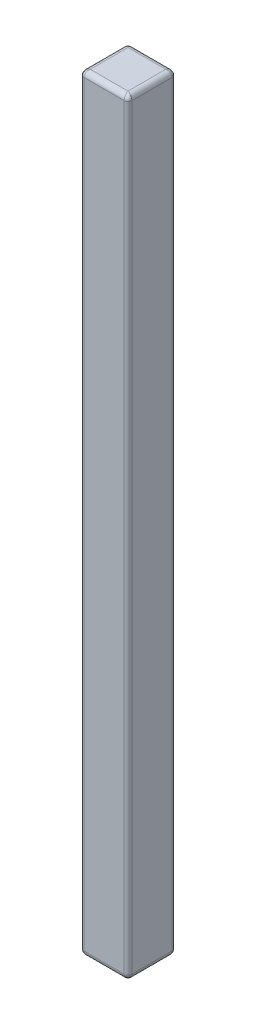
ISO-10303-21;
HEADER;
FILE_DESCRIPTION(('STEP AP214'),'2;1');
FILE_NAME('part.step','',(''),(''),'','','');
FILE_SCHEMA(('AUTOMOTIVE_DESIGN { 1 0 10303 214 1 1 1 1 }'));
ENDSEC;
DATA;
#1=APPLICATION_CONTEXT('core data for automotive mechanical design processes');
#2=APPLICATION_PROTOCOL_DEFINITION('international standard','automotive_design',2000,#1);
#3=PRODUCT_CONTEXT('',#1,'mechanical');
#4=PRODUCT('Part','Part','',(#3));
#5=PRODUCT_RELATED_PRODUCT_CATEGORY('part','',(#4));
#6=PRODUCT_DEFINITION_FORMATION('','',#4);
#7=PRODUCT_DEFINITION_CONTEXT('part definition',#1,'design');
#8=PRODUCT_DEFINITION('design','',#6,#7);
#9=PRODUCT_DEFINITION_SHAPE('','',#8);
#10=(LENGTH_UNIT() NAMED_UNIT(*) SI_UNIT(.MILLI.,.METRE.));
#11=(NAMED_UNIT(*) PLANE_ANGLE_UNIT() SI_UNIT($,.RADIAN.));
#12=(NAMED_UNIT(*) SI_UNIT($,.STERADIAN.) SOLID_ANGLE_UNIT());
#13=UNCERTAINTY_MEASURE_WITH_UNIT(LENGTH_MEASURE(1.E-05),#10,'distance_accuracy_value','');
#14=(GEOMETRIC_REPRESENTATION_CONTEXT(3) GLOBAL_UNCERTAINTY_ASSIGNED_CONTEXT((#13)) GLOBAL_UNIT_ASSIGNED_CONTEXT((#10,
#11,#12)) REPRESENTATION_CONTEXT('',''));
#15=CARTESIAN_POINT('',(0.,0.,0.));
#16=DIRECTION('',(0.,0.,1.));
#17=DIRECTION('',(1.,0.,0.));
#18=AXIS2_PLACEMENT_3D('',#15,#16,#17);
#19=CARTESIAN_POINT('',(1.475,0.,1.475));
#20=CARTESIAN_POINT('',(1.56475979010257,0.,1.49743994752564));
#21=CARTESIAN_POINT('',(1.77478910429061,0.0728311305779759,1.54994727607265));
#22=CARTESIAN_POINT('',(1.875,0.280320279863246,1.575));
#23=CARTESIAN_POINT('',(1.875,0.4,1.575));
#24=CARTESIAN_POINT('',(1.475,0.,1.475));
#25=CARTESIAN_POINT('',(1.55353981633974,0.,1.50865992128846));
#26=CARTESIAN_POINT('',(1.73652906928958,0.0438903059349456,1.58589297159778));
#27=CARTESIAN_POINT('',(1.875,0.256589087450941,1.65353981633975));
#28=CARTESIAN_POINT('',(1.875,0.4,1.65353981633975));
#29=CARTESIAN_POINT('',(1.475,0.,1.475));
#30=CARTESIAN_POINT('',(1.5310998688141,0.,1.5310998688141));
#31=CARTESIAN_POINT('',(1.65804151710079,0.0137242028562862,1.65804151710079));
#32=CARTESIAN_POINT('',(1.81013802673133,0.229651477541339,1.81013802673133));
#33=CARTESIAN_POINT('',(1.81013802673133,0.4,1.81013802673133));
#34=CARTESIAN_POINT('',(1.475,0.,1.475));
#35=CARTESIAN_POINT('',(1.50865992128846,0.,1.55353981633975));
#36=CARTESIAN_POINT('',(1.58589297159778,0.043890305934946,1.73652906928958));
#37=CARTESIAN_POINT('',(1.65353981633975,0.256589087450942,1.875));
#38=CARTESIAN_POINT('',(1.65353981633975,0.4,1.875));
#39=CARTESIAN_POINT('',(1.475,0.,1.475));
#40=CARTESIAN_POINT('',(1.49743994752564,0.,1.56475979010257));
#41=CARTESIAN_POINT('',(1.54994727607265,0.0728311305779767,1.77478910429061));
#42=CARTESIAN_POINT('',(1.575,0.280320279863246,1.875));
#43=CARTESIAN_POINT('',(1.575,0.4,1.875));
#44=B_SPLINE_SURFACE_WITH_KNOTS('',3,3,((#19,#20,#21,#22,#23),(#24,#25,#26,#27,#28),(#29,#30,
#31,#32,#33),(#34,#35,#36,#37,#38),(#39,#40,#41,#42,#43)),.UNSPECIFIED.,.F.,.F.,.F.,(4,1,4),(4,
1,4),(0.,0.5,1.),(-1.57079632679489,-0.897597901025654,0.),.UNSPECIFIED.);
#45=CARTESIAN_POINT('',(1.575,0.4,1.875));
#46=CARTESIAN_POINT('',(1.575,0.280320279863245,1.875));
#47=CARTESIAN_POINT('',(1.54994727607265,0.0728311305779759,1.77478910429061));
#48=CARTESIAN_POINT('',(1.49743994752564,0.,1.56475979010257));
#49=CARTESIAN_POINT('',(1.475,0.,1.475));
#50=B_SPLINE_CURVE_WITH_KNOTS('',3,(#45,#46,#47,#48,#49),.UNSPECIFIED.,.F.,.F.,(4,1,4),
(-1.57079632679489,-0.673198425769236,0.),.UNSPECIFIED.);
#51=CARTESIAN_POINT('',(1.475,0.,1.475));
#52=VERTEX_POINT('',#51);
#53=CARTESIAN_POINT('',(1.575,0.4,1.875));
#54=VERTEX_POINT('',#53);
#55=EDGE_CURVE('E350',#52,#54,#50,.F.);
#56=CARTESIAN_POINT('',(1.475,0.,1.475));
#57=CARTESIAN_POINT('',(1.56475979010257,0.,1.49743994752564));
#58=CARTESIAN_POINT('',(1.77478910429061,0.0728311305779759,1.54994727607265));
#59=CARTESIAN_POINT('',(1.875,0.280320279863246,1.575));
#60=CARTESIAN_POINT('',(1.875,0.4,1.575));
#61=B_SPLINE_CURVE_WITH_KNOTS('',3,(#56,#57,#58,#59,#60),.UNSPECIFIED.,.F.,.F.,(4,1,4),
(-1.57079632679489,-0.897597901025654,0.),.UNSPECIFIED.);
#62=CARTESIAN_POINT('',(1.875,0.4,1.575));
#63=VERTEX_POINT('',#62);
#64=EDGE_CURVE('E122',#63,#52,#61,.F.);
#65=CARTESIAN_POINT('',(1.875,0.4,1.575));
#66=CARTESIAN_POINT('',(1.875,0.4,1.65353981633975));
#67=CARTESIAN_POINT('',(1.81013802673133,0.4,1.81013802673133));
#68=CARTESIAN_POINT('',(1.65353981633975,0.4,1.875));
#69=CARTESIAN_POINT('',(1.575,0.4,1.875));
#70=B_SPLINE_CURVE_WITH_KNOTS('',3,(#65,#66,#67,#68,#69),.UNSPECIFIED.,.F.,.F.,(4,1,4),(0.,0.5,
1.),.UNSPECIFIED.);
#71=EDGE_CURVE('E339',#54,#63,#70,.F.);
#72=ORIENTED_EDGE('',*,*,#55,.F.);
#73=ORIENTED_EDGE('',*,*,#64,.F.);
#74=ORIENTED_EDGE('',*,*,#71,.F.);
#75=EDGE_LOOP('',(#72,#73,#74));
#76=FACE_BOUND('',#75,.T.);
#77=ADVANCED_FACE('F16',(#76),#44,.F.);
#78=CARTESIAN_POINT('',(1.875,59.6,1.575));
#79=CARTESIAN_POINT('',(1.875,59.7196797201368,1.575));
#80=CARTESIAN_POINT('',(1.7745726905343,59.9269092034348,1.54989317263358));
#81=CARTESIAN_POINT('',(1.56475979010257,60.,1.49743994752564));
#82=CARTESIAN_POINT('',(1.475,60.,1.475));
#83=CARTESIAN_POINT('',(1.875,59.6,1.65353981633975));
#84=CARTESIAN_POINT('',(1.875,59.7434109125491,1.65353981633975));
#85=CARTESIAN_POINT('',(1.73629691206911,59.9554370996997,1.58586715200935));
#86=CARTESIAN_POINT('',(1.55353981633975,60.,1.50865992128846));
#87=CARTESIAN_POINT('',(1.475,60.,1.475));
#88=CARTESIAN_POINT('',(1.80993704660503,59.6,1.80993704660503));
#89=CARTESIAN_POINT('',(1.80993704660503,59.7703485224587,1.80993704660503));
#90=CARTESIAN_POINT('',(1.65838332850583,59.9846052267059,1.65838332850583));
#91=CARTESIAN_POINT('',(1.5310998688141,60.,1.53109986881411));
#92=CARTESIAN_POINT('',(1.475,60.,1.475));
#93=CARTESIAN_POINT('',(1.65353981633975,59.6,1.875));
#94=CARTESIAN_POINT('',(1.65353981633975,59.7434109125491,1.875));
#95=CARTESIAN_POINT('',(1.58586715200935,59.9554370996997,1.73629691206911));
#96=CARTESIAN_POINT('',(1.50865992128846,60.,1.55353981633975));
#97=CARTESIAN_POINT('',(1.475,60.,1.475));
#98=CARTESIAN_POINT('',(1.575,59.6,1.875));
#99=CARTESIAN_POINT('',(1.575,59.7196797201368,1.875));
#100=CARTESIAN_POINT('',(1.54989317263358,59.9269092034348,1.7745726905343));
#101=CARTESIAN_POINT('',(1.49743994752564,60.,1.56475979010257));
#102=CARTESIAN_POINT('',(1.475,60.,1.475));
#103=B_SPLINE_SURFACE_WITH_KNOTS('',3,3,((#78,#79,#80,#81,#82),(#83,#84,#85,#86,#87),(#88,#89,
#90,#91,#92),(#93,#94,#95,#96,#97),(#98,#99,#100,#101,#102)),.UNSPECIFIED.,.F.,.F.,.F.,(4,1,4),
(4,1,4),(0.,0.5,1.),(0.,0.897597901025653,1.57079632679489),.UNSPECIFIED.);
#104=CARTESIAN_POINT('',(1.475,60.,1.475));
#105=CARTESIAN_POINT('',(1.49743994752564,60.,1.56475979010257));
#106=CARTESIAN_POINT('',(1.54989317263358,59.9269092034348,1.7745726905343));
#107=CARTESIAN_POINT('',(1.575,59.7196797201368,1.875));
#108=CARTESIAN_POINT('',(1.575,59.6,1.875));
#109=B_SPLINE_CURVE_WITH_KNOTS('',3,(#104,#105,#106,#107,#108),.UNSPECIFIED.,.F.,.F.,(4,1,4),
(0.,0.673198425769237,1.57079632679489),.UNSPECIFIED.);
#110=CARTESIAN_POINT('',(1.575,59.6,1.875));
#111=VERTEX_POINT('',#110);
#112=CARTESIAN_POINT('',(1.475,60.,1.475));
#113=VERTEX_POINT('',#112);
#114=EDGE_CURVE('E519',#111,#113,#109,.F.);
#115=CARTESIAN_POINT('',(1.575,59.6,1.875));
#116=CARTESIAN_POINT('',(1.65353981633975,59.6,1.875));
#117=CARTESIAN_POINT('',(1.80993704660503,59.6,1.80993704660503));
#118=CARTESIAN_POINT('',(1.875,59.6,1.65353981633975));
#119=CARTESIAN_POINT('',(1.875,59.6,1.575));
#120=B_SPLINE_CURVE_WITH_KNOTS('',3,(#115,#116,#117,#118,#119),.UNSPECIFIED.,.F.,.F.,(4,1,4),
(0.,0.5,1.),.UNSPECIFIED.);
#121=CARTESIAN_POINT('',(1.875,59.6,1.575));
#122=VERTEX_POINT('',#121);
#123=EDGE_CURVE('E307',#122,#111,#120,.F.);
#124=CARTESIAN_POINT('',(1.875,59.6,1.575));
#125=CARTESIAN_POINT('',(1.875,59.7196797201368,1.575));
#126=CARTESIAN_POINT('',(1.7745726905343,59.9269092034348,1.54989317263358));
#127=CARTESIAN_POINT('',(1.56475979010257,60.,1.49743994752564));
#128=CARTESIAN_POINT('',(1.475,60.,1.475));
#129=B_SPLINE_CURVE_WITH_KNOTS('',3,(#124,#125,#126,#127,#128),.UNSPECIFIED.,.F.,.F.,(4,1,4),
(0.,0.897597901025653,1.57079632679489),.UNSPECIFIED.);
#130=EDGE_CURVE('E267',#113,#122,#129,.F.);
#131=ORIENTED_EDGE('',*,*,#114,.F.);
#132=ORIENTED_EDGE('',*,*,#123,.F.);
#133=ORIENTED_EDGE('',*,*,#130,.F.);
#134=EDGE_LOOP('',(#131,#132,#133));
#135=FACE_BOUND('',#134,.T.);
#136=ADVANCED_FACE('F272',(#135),#103,.F.);
#137=CARTESIAN_POINT('',(1.475,0.,-1.475));
#138=CARTESIAN_POINT('',(1.49743994752564,0.,-1.56475979010257));
#139=CARTESIAN_POINT('',(1.54994727607265,0.0728311305779772,-1.77478910429061));
#140=CARTESIAN_POINT('',(1.575,0.280320279863246,-1.875));
#141=CARTESIAN_POINT('',(1.575,0.4,-1.875));
#142=CARTESIAN_POINT('',(1.475,0.,-1.475));
#143=CARTESIAN_POINT('',(1.50865992128846,0.,-1.55353981633975));
#144=CARTESIAN_POINT('',(1.58589297159778,0.0438903059349469,-1.73652906928958));
#145=CARTESIAN_POINT('',(1.65353981633975,0.256589087450941,-1.875));
#146=CARTESIAN_POINT('',(1.65353981633975,0.4,-1.875));
#147=CARTESIAN_POINT('',(1.475,0.,-1.475));
#148=CARTESIAN_POINT('',(1.5310998688141,0.,-1.5310998688141));
#149=CARTESIAN_POINT('',(1.65804151710079,0.0137242028562868,-1.65804151710079));
#150=CARTESIAN_POINT('',(1.81013802673133,0.22965147754134,-1.81013802673133));
#151=CARTESIAN_POINT('',(1.81013802673133,0.4,-1.81013802673133));
#152=CARTESIAN_POINT('',(1.475,0.,-1.475));
#153=CARTESIAN_POINT('',(1.55353981633975,0.,-1.50865992128846));
#154=CARTESIAN_POINT('',(1.73652906928958,0.0438903059349469,-1.58589297159778));
#155=CARTESIAN_POINT('',(1.875,0.256589087450941,-1.65353981633975));
#156=CARTESIAN_POINT('',(1.875,0.4,-1.65353981633975));
#157=CARTESIAN_POINT('',(1.475,0.,-1.475));
#158=CARTESIAN_POINT('',(1.56475979010257,0.,-1.49743994752564));
#159=CARTESIAN_POINT('',(1.77478910429061,0.0728311305779773,-1.54994727607265));
#160=CARTESIAN_POINT('',(1.875,0.280320279863246,-1.575));
#161=CARTESIAN_POINT('',(1.875,0.4,-1.575));
#162=B_SPLINE_SURFACE_WITH_KNOTS('',3,3,((#137,#138,#139,#140,#141),(#142,#143,#144,#145,#146),
(#147,#148,#149,#150,#151),(#152,#153,#154,#155,#156),(#157,#158,#159,#160,#161)),.UNSPECIFIED.,
.F.,.F.,.F.,(4,1,4),(4,1,4),(0.,0.5,1.),(-1.5707963267949,-0.897597901025655,0.),.UNSPECIFIED.);
#163=CARTESIAN_POINT('',(1.875,0.4,-1.575));
#164=CARTESIAN_POINT('',(1.875,0.280320279863246,-1.575));
#165=CARTESIAN_POINT('',(1.77478910429061,0.0728311305779773,-1.54994727607265));
#166=CARTESIAN_POINT('',(1.56475979010257,0.,-1.49743994752564));
#167=CARTESIAN_POINT('',(1.475,0.,-1.475));
#168=B_SPLINE_CURVE_WITH_KNOTS('',3,(#163,#164,#165,#166,#167),.UNSPECIFIED.,.F.,.F.,(4,1,4),
(-1.5707963267949,-0.673198425769245,0.),.UNSPECIFIED.);
#169=CARTESIAN_POINT('',(1.475,0.,-1.475));
#170=VERTEX_POINT('',#169);
#171=CARTESIAN_POINT('',(1.875,0.4,-1.575));
#172=VERTEX_POINT('',#171);
#173=EDGE_CURVE('E123',#170,#172,#168,.F.);
#174=CARTESIAN_POINT('',(1.475,0.,-1.475));
#175=CARTESIAN_POINT('',(1.49743994752564,0.,-1.56475979010257));
#176=CARTESIAN_POINT('',(1.54994727607265,0.0728311305779772,-1.77478910429061));
#177=CARTESIAN_POINT('',(1.575,0.280320279863246,-1.875));
#178=CARTESIAN_POINT('',(1.575,0.4,-1.875));
#179=B_SPLINE_CURVE_WITH_KNOTS('',3,(#174,#175,#176,#177,#178),.UNSPECIFIED.,.F.,.F.,(4,1,4),
(-1.5707963267949,-0.897597901025655,0.),.UNSPECIFIED.);
#180=CARTESIAN_POINT('',(1.575,0.4,-1.875));
#181=VERTEX_POINT('',#180);
#182=EDGE_CURVE('E144',#181,#170,#179,.F.);
#183=CARTESIAN_POINT('',(1.575,0.4,-1.875));
#184=CARTESIAN_POINT('',(1.65353981633975,0.4,-1.875));
#185=CARTESIAN_POINT('',(1.81013802673133,0.4,-1.81013802673133));
#186=CARTESIAN_POINT('',(1.875,0.4,-1.65353981633975));
#187=CARTESIAN_POINT('',(1.875,0.4,-1.575));
#188=B_SPLINE_CURVE_WITH_KNOTS('',3,(#183,#184,#185,#186,#187),.UNSPECIFIED.,.F.,.F.,(4,1,4),
(0.,0.5,1.),.UNSPECIFIED.);
#189=EDGE_CURVE('E131',#172,#181,#188,.F.);
#190=ORIENTED_EDGE('',*,*,#173,.F.);
#191=ORIENTED_EDGE('',*,*,#182,.F.);
#192=ORIENTED_EDGE('',*,*,#189,.F.);
#193=EDGE_LOOP('',(#190,#191,#192));
#194=FACE_BOUND('',#193,.T.);
#195=ADVANCED_FACE('F141',(#194),#162,.F.);
#196=CARTESIAN_POINT('',(1.575,59.6,-1.875));
#197=CARTESIAN_POINT('',(1.575,59.6897597901026,-1.875));
#198=CARTESIAN_POINT('',(1.55672730085871,59.8995726905343,-1.80190920343482));
#199=CARTESIAN_POINT('',(1.50491993003419,60.,-1.59467972013676));
#200=CARTESIAN_POINT('',(1.475,60.,-1.475));
#201=CARTESIAN_POINT('',(1.65353981633975,59.6,-1.875));
#202=CARTESIAN_POINT('',(1.65353981633975,59.7075581844118,-1.875));
#203=CARTESIAN_POINT('',(1.59995221666263,59.9354884301486,-1.76715023670219));
#204=CARTESIAN_POINT('',(1.51987989505128,60.,-1.57971975511966));
#205=CARTESIAN_POINT('',(1.475,60.,-1.475));
#206=CARTESIAN_POINT('',(1.80993704660503,59.6,-1.80993704660503));
#207=CARTESIAN_POINT('',(1.80993704660503,59.727761391844,-1.80993704660503));
#208=CARTESIAN_POINT('',(1.68700947055543,59.9731401052436,-1.68700947055543));
#209=CARTESIAN_POINT('',(1.54979982508548,60.,-1.54979982508547));
#210=CARTESIAN_POINT('',(1.475,60.,-1.475));
#211=CARTESIAN_POINT('',(1.875,59.6,-1.65353981633975));
#212=CARTESIAN_POINT('',(1.875,59.7075581844118,-1.65353981633975));
#213=CARTESIAN_POINT('',(1.76715023670218,59.9354884301486,-1.59995221666263));
#214=CARTESIAN_POINT('',(1.57971975511967,60.,-1.51987989505128));
#215=CARTESIAN_POINT('',(1.475,60.,-1.475));
#216=CARTESIAN_POINT('',(1.875,59.6,-1.575));
#217=CARTESIAN_POINT('',(1.875,59.6897597901026,-1.575));
#218=CARTESIAN_POINT('',(1.80190920343482,59.8995726905343,-1.55672730085871));
#219=CARTESIAN_POINT('',(1.59467972013676,60.,-1.50491993003419));
#220=CARTESIAN_POINT('',(1.475,60.,-1.475));
#221=B_SPLINE_SURFACE_WITH_KNOTS('',3,3,((#196,#197,#198,#199,#200),(#201,#202,#203,#204,#205),
(#206,#207,#208,#209,#210),(#211,#212,#213,#214,#215),(#216,#217,#218,#219,#220)),.UNSPECIFIED.,
.F.,.F.,.F.,(4,1,4),(4,1,4),(0.,0.5,1.),(0.,0.673198425769241,1.5707963267949),.UNSPECIFIED.);
#222=CARTESIAN_POINT('',(1.475,60.,-1.475));
#223=CARTESIAN_POINT('',(1.59467972013676,60.,-1.50491993003419));
#224=CARTESIAN_POINT('',(1.80190920343482,59.8995726905343,-1.55672730085871));
#225=CARTESIAN_POINT('',(1.875,59.6897597901026,-1.575));
#226=CARTESIAN_POINT('',(1.875,59.6,-1.575));
#227=B_SPLINE_CURVE_WITH_KNOTS('',3,(#222,#223,#224,#225,#226),.UNSPECIFIED.,.F.,.F.,(4,1,4),
(0.,0.897597901025659,1.5707963267949),.UNSPECIFIED.);
#228=CARTESIAN_POINT('',(1.875,59.6,-1.575));
#229=VERTEX_POINT('',#228);
#230=CARTESIAN_POINT('',(1.475,60.,-1.475));
#231=VERTEX_POINT('',#230);
#232=EDGE_CURVE('E476',#229,#231,#227,.F.);
#233=CARTESIAN_POINT('',(1.875,59.6,-1.575));
#234=CARTESIAN_POINT('',(1.875,59.6,-1.65353981633975));
#235=CARTESIAN_POINT('',(1.80993704660503,59.6,-1.80993704660503));
#236=CARTESIAN_POINT('',(1.65353981633975,59.6,-1.875));
#237=CARTESIAN_POINT('',(1.575,59.6,-1.875));
#238=B_SPLINE_CURVE_WITH_KNOTS('',3,(#233,#234,#235,#236,#237),.UNSPECIFIED.,.F.,.F.,(4,1,4),
(0.,0.5,1.),.UNSPECIFIED.);
#239=CARTESIAN_POINT('',(1.575,59.6,-1.875));
#240=VERTEX_POINT('',#239);
#241=EDGE_CURVE('E134',#240,#229,#238,.F.);
#242=CARTESIAN_POINT('',(1.575,59.6,-1.875));
#243=CARTESIAN_POINT('',(1.575,59.6897597901026,-1.875));
#244=CARTESIAN_POINT('',(1.55672730085871,59.8995726905343,-1.80190920343482));
#245=CARTESIAN_POINT('',(1.50491993003419,60.,-1.59467972013676));
#246=CARTESIAN_POINT('',(1.475,60.,-1.475));
#247=B_SPLINE_CURVE_WITH_KNOTS('',3,(#242,#243,#244,#245,#246),.UNSPECIFIED.,.F.,.F.,(4,1,4),
(0.,0.673198425769241,1.5707963267949),.UNSPECIFIED.);
#248=EDGE_CURVE('E147',#231,#240,#247,.F.);
#249=ORIENTED_EDGE('',*,*,#232,.F.);
#250=ORIENTED_EDGE('',*,*,#241,.F.);
#251=ORIENTED_EDGE('',*,*,#248,.F.);
#252=EDGE_LOOP('',(#249,#250,#251));
#253=FACE_BOUND('',#252,.T.);
#254=ADVANCED_FACE('F217',(#253),#221,.F.);
#255=CARTESIAN_POINT('',(1.875,0.,1.575));
#256=DIRECTION('',(1.,0.,0.));
#257=DIRECTION('',(0.,0.,-1.));
#258=AXIS2_PLACEMENT_3D('',#255,#256,#257);
#259=PLANE('',#258);
#260=DIRECTION('',(0.,0.,-1.));
#261=VECTOR('',#260,1.);
#262=CARTESIAN_POINT('',(1.875,59.6,0.787500000000001));
#263=LINE('',#262,#261);
#264=EDGE_CURVE('E496',#122,#229,#263,.T.);
#265=ORIENTED_EDGE('',*,*,#264,.F.);
#266=DIRECTION('',(0.,1.,0.));
#267=VECTOR('',#266,1.);
#268=CARTESIAN_POINT('',(1.875,0.,1.575));
#269=LINE('',#268,#267);
#270=EDGE_CURVE('E118',#63,#122,#269,.T.);
#271=ORIENTED_EDGE('',*,*,#270,.F.);
#272=DIRECTION('',(0.,0.,-1.));
#273=VECTOR('',#272,1.);
#274=CARTESIAN_POINT('',(1.875,0.4,0.787500000000001));
#275=LINE('',#274,#273);
#276=EDGE_CURVE('E111',#172,#63,#275,.F.);
#277=ORIENTED_EDGE('',*,*,#276,.F.);
#278=DIRECTION('',(0.,1.,0.));
#279=VECTOR('',#278,1.);
#280=CARTESIAN_POINT('',(1.875,0.,-1.575));
#281=LINE('',#280,#279);
#282=EDGE_CURVE('E115',#229,#172,#281,.F.);
#283=ORIENTED_EDGE('',*,*,#282,.F.);
#284=EDGE_LOOP('',(#265,#271,#277,#283));
#285=FACE_BOUND('',#284,.T.);
#286=ADVANCED_FACE('F114',(#285),#259,.T.);
#287=CARTESIAN_POINT('',(1.475,0.4,0.787500000000001));
#288=DIRECTION('',(0.,0.,-1.));
#289=DIRECTION('',(-1.,0.,0.));
#290=AXIS2_PLACEMENT_3D('',#287,#288,#289);
#291=CYLINDRICAL_SURFACE('',#290,0.4);
#292=ORIENTED_EDGE('',*,*,#64,.T.);
#293=DIRECTION('',(0.,0.,1.));
#294=VECTOR('',#293,1.);
#295=CARTESIAN_POINT('',(1.475,0.,0.));
#296=LINE('',#295,#294);
#297=EDGE_CURVE('E136',#52,#170,#296,.F.);
#298=ORIENTED_EDGE('',*,*,#297,.T.);
#299=ORIENTED_EDGE('',*,*,#173,.T.);
#300=ORIENTED_EDGE('',*,*,#276,.T.);
#301=EDGE_LOOP('',(#292,#298,#299,#300));
#302=FACE_BOUND('',#301,.T.);
#303=ADVANCED_FACE('F151',(#302),#291,.T.);
#304=CARTESIAN_POINT('',(-0.787500000000001,0.4,1.475));
#305=DIRECTION('',(1.,0.,0.));
#306=DIRECTION('',(0.,0.,-1.));
#307=AXIS2_PLACEMENT_3D('',#304,#305,#306);
#308=CYLINDRICAL_SURFACE('',#307,0.4);
#309=ORIENTED_EDGE('',*,*,#55,.T.);
#310=DIRECTION('',(1.,0.,0.));
#311=VECTOR('',#310,1.);
#312=CARTESIAN_POINT('',(-1.575,0.4,1.875));
#313=LINE('',#312,#311);
#314=CARTESIAN_POINT('',(-1.575,0.4,1.875));
#315=VERTEX_POINT('',#314);
#316=EDGE_CURVE('E373',#315,#54,#313,.T.);
#317=ORIENTED_EDGE('',*,*,#316,.F.);
#318=CARTESIAN_POINT('',(-1.475,0.,1.475));
#319=CARTESIAN_POINT('',(-1.49743994752564,0.,1.56475979010257));
#320=CARTESIAN_POINT('',(-1.54994727607266,0.0728311305779765,1.77478910429061));
#321=CARTESIAN_POINT('',(-1.575,0.280320279863245,1.875));
#322=CARTESIAN_POINT('',(-1.575,0.4,1.875));
#323=B_SPLINE_CURVE_WITH_KNOTS('',3,(#318,#319,#320,#321,#322),.UNSPECIFIED.,.F.,.F.,(4,1,4),
(-1.57079632679489,-0.897597901025654,0.),.UNSPECIFIED.);
#324=CARTESIAN_POINT('',(-1.475,0.,1.475));
#325=VERTEX_POINT('',#324);
#326=EDGE_CURVE('E393',#315,#325,#323,.F.);
#327=ORIENTED_EDGE('',*,*,#326,.T.);
#328=DIRECTION('',(1.,0.,0.));
#329=VECTOR('',#328,1.);
#330=CARTESIAN_POINT('',(0.,0.,1.475));
#331=LINE('',#330,#329);
#332=EDGE_CURVE('E376',#325,#52,#331,.T.);
#333=ORIENTED_EDGE('',*,*,#332,.T.);
#334=EDGE_LOOP('',(#309,#317,#327,#333));
#335=FACE_BOUND('',#334,.T.);
#336=ADVANCED_FACE('F171',(#335),#308,.T.);
#337=CARTESIAN_POINT('',(1.575,0.,1.575));
#338=DIRECTION('',(0.,1.,0.));
#339=DIRECTION('',(0.,0.,1.));
#340=AXIS2_PLACEMENT_3D('',#337,#338,#339);
#341=CYLINDRICAL_SURFACE('',#340,0.299999999999999);
#342=ORIENTED_EDGE('',*,*,#123,.T.);
#343=DIRECTION('',(0.,1.,0.));
#344=VECTOR('',#343,1.);
#345=CARTESIAN_POINT('',(1.575,0.,1.875));
#346=LINE('',#345,#344);
#347=EDGE_CURVE('E369',#54,#111,#346,.T.);
#348=ORIENTED_EDGE('',*,*,#347,.F.);
#349=ORIENTED_EDGE('',*,*,#71,.T.);
#350=ORIENTED_EDGE('',*,*,#270,.T.);
#351=EDGE_LOOP('',(#342,#348,#349,#350));
#352=FACE_BOUND('',#351,.T.);
#353=ADVANCED_FACE('F313',(#352),#341,.T.);
#354=CARTESIAN_POINT('',(-0.787500000000001,59.6,1.475));
#355=DIRECTION('',(1.,0.,0.));
#356=DIRECTION('',(0.,0.,-1.));
#357=AXIS2_PLACEMENT_3D('',#354,#355,#356);
#358=CYLINDRICAL_SURFACE('',#357,0.4);
#359=ORIENTED_EDGE('',*,*,#114,.T.);
#360=DIRECTION('',(1.,0.,0.));
#361=VECTOR('',#360,1.);
#362=CARTESIAN_POINT('',(0.,60.,1.475));
#363=LINE('',#362,#361);
#364=CARTESIAN_POINT('',(-1.475,60.,1.475));
#365=VERTEX_POINT('',#364);
#366=EDGE_CURVE('E469',#365,#113,#363,.T.);
#367=ORIENTED_EDGE('',*,*,#366,.F.);
#368=CARTESIAN_POINT('',(-1.575,59.6,1.875));
#369=CARTESIAN_POINT('',(-1.575,59.6897597901026,1.875));
#370=CARTESIAN_POINT('',(-1.55672730085871,59.8995726905343,1.80190920343482));
#371=CARTESIAN_POINT('',(-1.50491993003419,60.,1.59467972013676));
#372=CARTESIAN_POINT('',(-1.475,60.,1.475));
#373=B_SPLINE_CURVE_WITH_KNOTS('',3,(#368,#369,#370,#371,#372),.UNSPECIFIED.,.F.,.F.,(4,1,4),
(0.,0.67319842576924,1.57079632679489),.UNSPECIFIED.);
#374=CARTESIAN_POINT('',(-1.575,59.6,1.875));
#375=VERTEX_POINT('',#374);
#376=EDGE_CURVE('E508',#365,#375,#373,.F.);
#377=ORIENTED_EDGE('',*,*,#376,.T.);
#378=DIRECTION('',(1.,0.,0.));
#379=VECTOR('',#378,1.);
#380=CARTESIAN_POINT('',(-1.575,59.6,1.875));
#381=LINE('',#380,#379);
#382=EDGE_CURVE('E541',#111,#375,#381,.F.);
#383=ORIENTED_EDGE('',*,*,#382,.F.);
#384=EDGE_LOOP('',(#359,#367,#377,#383));
#385=FACE_BOUND('',#384,.T.);
#386=ADVANCED_FACE('F322',(#385),#358,.T.);
#387=CARTESIAN_POINT('',(1.475,59.6,0.787500000000001));
#388=DIRECTION('',(0.,0.,-1.));
#389=DIRECTION('',(-1.,0.,0.));
#390=AXIS2_PLACEMENT_3D('',#387,#388,#389);
#391=CYLINDRICAL_SURFACE('',#390,0.4);
#392=ORIENTED_EDGE('',*,*,#130,.T.);
#393=ORIENTED_EDGE('',*,*,#264,.T.);
#394=ORIENTED_EDGE('',*,*,#232,.T.);
#395=DIRECTION('',(0.,0.,1.));
#396=VECTOR('',#395,1.);
#397=CARTESIAN_POINT('',(1.475,60.,0.));
#398=LINE('',#397,#396);
#399=EDGE_CURVE('E460',#113,#231,#398,.F.);
#400=ORIENTED_EDGE('',*,*,#399,.F.);
#401=EDGE_LOOP('',(#392,#393,#394,#400));
#402=FACE_BOUND('',#401,.T.);
#403=ADVANCED_FACE('F482',(#402),#391,.T.);
#404=CARTESIAN_POINT('',(0.787500000000001,0.4,-1.475));
#405=DIRECTION('',(-1.,0.,0.));
#406=DIRECTION('',(0.,0.,1.));
#407=AXIS2_PLACEMENT_3D('',#404,#405,#406);
#408=CYLINDRICAL_SURFACE('',#407,0.4);
#409=ORIENTED_EDGE('',*,*,#182,.T.);
#410=DIRECTION('',(1.,0.,0.));
#411=VECTOR('',#410,1.);
#412=CARTESIAN_POINT('',(0.,0.,-1.475));
#413=LINE('',#412,#411);
#414=CARTESIAN_POINT('',(-1.475,0.,-1.475));
#415=VERTEX_POINT('',#414);
#416=EDGE_CURVE('E402',#170,#415,#413,.F.);
#417=ORIENTED_EDGE('',*,*,#416,.T.);
#418=CARTESIAN_POINT('',(-1.575,0.4,-1.875));
#419=CARTESIAN_POINT('',(-1.575,0.280320279863245,-1.875));
#420=CARTESIAN_POINT('',(-1.54994727607265,0.0728311305779763,-1.77478910429061));
#421=CARTESIAN_POINT('',(-1.49743994752564,0.,-1.56475979010257));
#422=CARTESIAN_POINT('',(-1.475,0.,-1.475));
#423=B_SPLINE_CURVE_WITH_KNOTS('',3,(#418,#419,#420,#421,#422),.UNSPECIFIED.,.F.,.F.,(4,1,4),
(-1.57079632679489,-0.673198425769236,0.),.UNSPECIFIED.);
#424=CARTESIAN_POINT('',(-1.575,0.4,-1.875));
#425=VERTEX_POINT('',#424);
#426=EDGE_CURVE('E610',#415,#425,#423,.F.);
#427=ORIENTED_EDGE('',*,*,#426,.T.);
#428=DIRECTION('',(-1.,0.,0.));
#429=VECTOR('',#428,1.);
#430=CARTESIAN_POINT('',(1.575,0.4,-1.875));
#431=LINE('',#430,#429);
#432=EDGE_CURVE('E598',#181,#425,#431,.T.);
#433=ORIENTED_EDGE('',*,*,#432,.F.);
#434=EDGE_LOOP('',(#409,#417,#427,#433));
#435=FACE_BOUND('',#434,.T.);
#436=ADVANCED_FACE('F490',(#435),#408,.T.);
#437=CARTESIAN_POINT('',(0.787500000000001,59.6,-1.475));
#438=DIRECTION('',(-1.,0.,0.));
#439=DIRECTION('',(0.,0.,1.));
#440=AXIS2_PLACEMENT_3D('',#437,#438,#439);
#441=CYLINDRICAL_SURFACE('',#440,0.4);
#442=ORIENTED_EDGE('',*,*,#248,.T.);
#443=DIRECTION('',(-1.,0.,0.));
#444=VECTOR('',#443,1.);
#445=CARTESIAN_POINT('',(1.575,59.6,-1.875));
#446=LINE('',#445,#444);
#447=CARTESIAN_POINT('',(-1.575,59.6,-1.875));
#448=VERTEX_POINT('',#447);
#449=EDGE_CURVE('E606',#448,#240,#446,.F.);
#450=ORIENTED_EDGE('',*,*,#449,.F.);
#451=CARTESIAN_POINT('',(-1.475,60.,-1.475));
#452=CARTESIAN_POINT('',(-1.50491993003418,60.,-1.59467972013676));
#453=CARTESIAN_POINT('',(-1.55672730085871,59.8995726905343,-1.80190920343482));
#454=CARTESIAN_POINT('',(-1.575,59.6897597901026,-1.875));
#455=CARTESIAN_POINT('',(-1.575,59.6,-1.875));
#456=B_SPLINE_CURVE_WITH_KNOTS('',3,(#451,#452,#453,#454,#455),.UNSPECIFIED.,.F.,.F.,(4,1,4),
(0.,0.89759790102565,1.57079632679489),.UNSPECIFIED.);
#457=CARTESIAN_POINT('',(-1.475,60.,-1.475));
#458=VERTEX_POINT('',#457);
#459=EDGE_CURVE('E607',#448,#458,#456,.F.);
#460=ORIENTED_EDGE('',*,*,#459,.T.);
#461=DIRECTION('',(1.,0.,0.));
#462=VECTOR('',#461,1.);
#463=CARTESIAN_POINT('',(0.,60.,-1.475));
#464=LINE('',#463,#462);
#465=EDGE_CURVE('E468',#231,#458,#464,.F.);
#466=ORIENTED_EDGE('',*,*,#465,.F.);
#467=EDGE_LOOP('',(#442,#450,#460,#466));
#468=FACE_BOUND('',#467,.T.);
#469=ADVANCED_FACE('F200',(#468),#441,.T.);
#470=CARTESIAN_POINT('',(1.575,0.,-1.575));
#471=DIRECTION('',(0.,1.,0.));
#472=DIRECTION('',(0.,0.,1.));
#473=AXIS2_PLACEMENT_3D('',#470,#471,#472);
#474=CYLINDRICAL_SURFACE('',#473,0.299999999999999);
#475=ORIENTED_EDGE('',*,*,#241,.T.);
#476=ORIENTED_EDGE('',*,*,#282,.T.);
#477=ORIENTED_EDGE('',*,*,#189,.T.);
#478=DIRECTION('',(0.,1.,0.));
#479=VECTOR('',#478,1.);
#480=CARTESIAN_POINT('',(1.575,0.,-1.875));
#481=LINE('',#480,#479);
#482=EDGE_CURVE('E551',#240,#181,#481,.F.);
#483=ORIENTED_EDGE('',*,*,#482,.F.);
#484=EDGE_LOOP('',(#475,#476,#477,#483));
#485=FACE_BOUND('',#484,.T.);
#486=ADVANCED_FACE('F129',(#485),#474,.T.);
#487=CARTESIAN_POINT('',(0.,0.,0.));
#488=DIRECTION('',(0.,1.,0.));
#489=DIRECTION('',(0.,0.,1.));
#490=AXIS2_PLACEMENT_3D('',#487,#488,#489);
#491=PLANE('',#490);
#492=DIRECTION('',(0.,0.,1.));
#493=VECTOR('',#492,1.);
#494=CARTESIAN_POINT('',(-1.475,0.,-0.787500000000001));
#495=LINE('',#494,#493);
#496=EDGE_CURVE('E554',#415,#325,#495,.T.);
#497=ORIENTED_EDGE('',*,*,#496,.F.);
#498=ORIENTED_EDGE('',*,*,#416,.F.);
#499=ORIENTED_EDGE('',*,*,#297,.F.);
#500=ORIENTED_EDGE('',*,*,#332,.F.);
#501=EDGE_LOOP('',(#497,#498,#499,#500));
#502=FACE_BOUND('',#501,.T.);
#503=ADVANCED_FACE('F199',(#502),#491,.F.);
#504=CARTESIAN_POINT('',(-1.475,0.,1.475));
#505=CARTESIAN_POINT('',(-1.49743994752564,0.,1.56475979010257));
#506=CARTESIAN_POINT('',(-1.54994727607266,0.0728311305779765,1.77478910429061));
#507=CARTESIAN_POINT('',(-1.575,0.280320279863245,1.875));
#508=CARTESIAN_POINT('',(-1.575,0.4,1.875));
#509=CARTESIAN_POINT('',(-1.475,0.,1.475));
#510=CARTESIAN_POINT('',(-1.50865992128846,0.,1.55353981633975));
#511=CARTESIAN_POINT('',(-1.58589297159778,0.0438903059349464,1.73652906928958));
#512=CARTESIAN_POINT('',(-1.65353981633975,0.256589087450941,1.875));
#513=CARTESIAN_POINT('',(-1.65353981633975,0.4,1.875));
#514=CARTESIAN_POINT('',(-1.475,0.,1.475));
#515=CARTESIAN_POINT('',(-1.5310998688141,0.,1.5310998688141));
#516=CARTESIAN_POINT('',(-1.65804151710079,0.0137242028562863,1.65804151710079));
#517=CARTESIAN_POINT('',(-1.81013802673133,0.229651477541339,1.81013802673133));
#518=CARTESIAN_POINT('',(-1.81013802673133,0.4,1.81013802673133));
#519=CARTESIAN_POINT('',(-1.475,0.,1.475));
#520=CARTESIAN_POINT('',(-1.55353981633975,0.,1.50865992128846));
#521=CARTESIAN_POINT('',(-1.73652906928958,0.0438903059349463,1.58589297159778));
#522=CARTESIAN_POINT('',(-1.875,0.256589087450941,1.65353981633975));
#523=CARTESIAN_POINT('',(-1.875,0.4,1.65353981633975));
#524=CARTESIAN_POINT('',(-1.475,0.,1.475));
#525=CARTESIAN_POINT('',(-1.56475979010257,0.,1.49743994752564));
#526=CARTESIAN_POINT('',(-1.77478910429061,0.0728311305779766,1.54994727607265));
#527=CARTESIAN_POINT('',(-1.875,0.280320279863246,1.575));
#528=CARTESIAN_POINT('',(-1.875,0.4,1.575));
#529=B_SPLINE_SURFACE_WITH_KNOTS('',3,3,((#504,#505,#506,#507,#508),(#509,#510,#511,#512,#513),
(#514,#515,#516,#517,#518),(#519,#520,#521,#522,#523),(#524,#525,#526,#527,#528)),.UNSPECIFIED.,
.F.,.F.,.F.,(4,1,4),(4,1,4),(0.,0.5,1.),(-1.57079632679489,-0.897597901025654,0.),.UNSPECIFIED.);
#530=CARTESIAN_POINT('',(-1.875,0.4,1.575));
#531=CARTESIAN_POINT('',(-1.875,0.280320279863246,1.575));
#532=CARTESIAN_POINT('',(-1.77478910429061,0.0728311305779764,1.54994727607265));
#533=CARTESIAN_POINT('',(-1.56475979010257,0.,1.49743994752564));
#534=CARTESIAN_POINT('',(-1.475,0.,1.475));
#535=B_SPLINE_CURVE_WITH_KNOTS('',3,(#530,#531,#532,#533,#534),.UNSPECIFIED.,.F.,.F.,(4,1,4),
(-1.57079632679489,-0.673198425769236,0.),.UNSPECIFIED.);
#536=CARTESIAN_POINT('',(-1.875,0.4,1.575));
#537=VERTEX_POINT('',#536);
#538=EDGE_CURVE('E544',#325,#537,#535,.F.);
#539=CARTESIAN_POINT('',(-1.575,0.4,1.875));
#540=CARTESIAN_POINT('',(-1.65353981633975,0.4,1.875));
#541=CARTESIAN_POINT('',(-1.81013802673133,0.4,1.81013802673133));
#542=CARTESIAN_POINT('',(-1.875,0.4,1.65353981633975));
#543=CARTESIAN_POINT('',(-1.875,0.4,1.575));
#544=B_SPLINE_CURVE_WITH_KNOTS('',3,(#539,#540,#541,#542,#543),.UNSPECIFIED.,.F.,.F.,(4,1,4),
(0.,0.5,1.),.UNSPECIFIED.);
#545=EDGE_CURVE('E546',#537,#315,#544,.F.);
#546=ORIENTED_EDGE('',*,*,#538,.F.);
#547=ORIENTED_EDGE('',*,*,#326,.F.);
#548=ORIENTED_EDGE('',*,*,#545,.F.);
#549=EDGE_LOOP('',(#546,#547,#548));
#550=FACE_BOUND('',#549,.T.);
#551=ADVANCED_FACE('F233',(#550),#529,.F.);
#552=CARTESIAN_POINT('',(-1.575,0.,1.875));
#553=DIRECTION('',(0.,0.,1.));
#554=DIRECTION('',(1.,0.,0.));
#555=AXIS2_PLACEMENT_3D('',#552,#553,#554);
#556=PLANE('',#555);
#557=ORIENTED_EDGE('',*,*,#382,.T.);
#558=DIRECTION('',(0.,1.,0.));
#559=VECTOR('',#558,1.);
#560=CARTESIAN_POINT('',(-1.575,0.,1.875));
#561=LINE('',#560,#559);
#562=EDGE_CURVE('E558',#315,#375,#561,.T.);
#563=ORIENTED_EDGE('',*,*,#562,.F.);
#564=ORIENTED_EDGE('',*,*,#316,.T.);
#565=ORIENTED_EDGE('',*,*,#347,.T.);
#566=EDGE_LOOP('',(#557,#563,#564,#565));
#567=FACE_BOUND('',#566,.T.);
#568=ADVANCED_FACE('F645',(#567),#556,.T.);
#569=CARTESIAN_POINT('',(-1.575,59.6,1.875));
#570=CARTESIAN_POINT('',(-1.575,59.6897597901026,1.875));
#571=CARTESIAN_POINT('',(-1.55672730085871,59.8995726905343,1.80190920343482));
#572=CARTESIAN_POINT('',(-1.50491993003419,60.,1.59467972013676));
#573=CARTESIAN_POINT('',(-1.475,60.,1.475));
#574=CARTESIAN_POINT('',(-1.65353981633975,59.6,1.875));
#575=CARTESIAN_POINT('',(-1.65353981633975,59.7075581844118,1.875));
#576=CARTESIAN_POINT('',(-1.59995221666263,59.9354884301486,1.76715023670219));
#577=CARTESIAN_POINT('',(-1.51987989505129,60.,1.57971975511966));
#578=CARTESIAN_POINT('',(-1.475,60.,1.475));
#579=CARTESIAN_POINT('',(-1.80993704660503,59.6,1.80993704660503));
#580=CARTESIAN_POINT('',(-1.80993704660503,59.727761391844,1.80993704660503));
#581=CARTESIAN_POINT('',(-1.68700947055543,59.9731401052436,1.68700947055543));
#582=CARTESIAN_POINT('',(-1.54979982508548,60.,1.54979982508547));
#583=CARTESIAN_POINT('',(-1.475,60.,1.475));
#584=CARTESIAN_POINT('',(-1.875,59.6,1.65353981633975));
#585=CARTESIAN_POINT('',(-1.875,59.7075581844118,1.65353981633975));
#586=CARTESIAN_POINT('',(-1.76715023670219,59.9354884301486,1.59995221666263));
#587=CARTESIAN_POINT('',(-1.57971975511967,60.,1.51987989505128));
#588=CARTESIAN_POINT('',(-1.475,60.,1.475));
#589=CARTESIAN_POINT('',(-1.875,59.6,1.575));
#590=CARTESIAN_POINT('',(-1.875,59.6897597901026,1.575));
#591=CARTESIAN_POINT('',(-1.80190920343482,59.8995726905343,1.55672730085871));
#592=CARTESIAN_POINT('',(-1.59467972013676,60.,1.50491993003418));
#593=CARTESIAN_POINT('',(-1.475,60.,1.475));
#594=B_SPLINE_SURFACE_WITH_KNOTS('',3,3,((#569,#570,#571,#572,#573),(#574,#575,#576,#577,#578),
(#579,#580,#581,#582,#583),(#584,#585,#586,#587,#588),(#589,#590,#591,#592,#593)),.UNSPECIFIED.,
.F.,.F.,.F.,(4,1,4),(4,1,4),(0.,0.5,1.),(0.,0.67319842576924,1.57079632679489),.UNSPECIFIED.);
#595=CARTESIAN_POINT('',(-1.475,60.,1.475));
#596=CARTESIAN_POINT('',(-1.59467972013676,60.,1.50491993003418));
#597=CARTESIAN_POINT('',(-1.80190920343482,59.8995726905343,1.55672730085871));
#598=CARTESIAN_POINT('',(-1.875,59.6897597901026,1.575));
#599=CARTESIAN_POINT('',(-1.875,59.6,1.575));
#600=B_SPLINE_CURVE_WITH_KNOTS('',3,(#595,#596,#597,#598,#599),.UNSPECIFIED.,.F.,.F.,(4,1,4),
(0.,0.89759790102565,1.57079632679489),.UNSPECIFIED.);
#601=CARTESIAN_POINT('',(-1.875,59.6,1.575));
#602=VERTEX_POINT('',#601);
#603=EDGE_CURVE('E671',#602,#365,#600,.F.);
#604=CARTESIAN_POINT('',(-1.875,59.6,1.575));
#605=CARTESIAN_POINT('',(-1.875,59.6,1.65353981633975));
#606=CARTESIAN_POINT('',(-1.80993704660503,59.6,1.80993704660503));
#607=CARTESIAN_POINT('',(-1.65353981633975,59.6,1.875));
#608=CARTESIAN_POINT('',(-1.575,59.6,1.875));
#609=B_SPLINE_CURVE_WITH_KNOTS('',3,(#604,#605,#606,#607,#608),.UNSPECIFIED.,.F.,.F.,(4,1,4),
(0.,0.5,1.),.UNSPECIFIED.);
#610=EDGE_CURVE('E691',#375,#602,#609,.F.);
#611=ORIENTED_EDGE('',*,*,#603,.F.);
#612=ORIENTED_EDGE('',*,*,#610,.F.);
#613=ORIENTED_EDGE('',*,*,#376,.F.);
#614=EDGE_LOOP('',(#611,#612,#613));
#615=FACE_BOUND('',#614,.T.);
#616=ADVANCED_FACE('F438',(#615),#594,.F.);
#617=CARTESIAN_POINT('',(0.,60.,0.));
#618=DIRECTION('',(0.,1.,0.));
#619=DIRECTION('',(0.,0.,1.));
#620=AXIS2_PLACEMENT_3D('',#617,#618,#619);
#621=PLANE('',#620);
#622=ORIENTED_EDGE('',*,*,#465,.T.);
#623=DIRECTION('',(0.,0.,1.));
#624=VECTOR('',#623,1.);
#625=CARTESIAN_POINT('',(-1.475,60.,-0.787500000000001));
#626=LINE('',#625,#624);
#627=EDGE_CURVE('E668',#365,#458,#626,.F.);
#628=ORIENTED_EDGE('',*,*,#627,.F.);
#629=ORIENTED_EDGE('',*,*,#366,.T.);
#630=ORIENTED_EDGE('',*,*,#399,.T.);
#631=EDGE_LOOP('',(#622,#628,#629,#630));
#632=FACE_BOUND('',#631,.T.);
#633=ADVANCED_FACE('F437',(#632),#621,.T.);
#634=CARTESIAN_POINT('',(-1.475,0.,-1.475));
#635=CARTESIAN_POINT('',(-1.56475979010257,0.,-1.49743994752564));
#636=CARTESIAN_POINT('',(-1.77478910429061,0.0728311305779768,-1.54994727607265));
#637=CARTESIAN_POINT('',(-1.875,0.280320279863246,-1.575));
#638=CARTESIAN_POINT('',(-1.875,0.4,-1.575));
#639=CARTESIAN_POINT('',(-1.475,0.,-1.475));
#640=CARTESIAN_POINT('',(-1.55353981633975,0.,-1.50865992128846));
#641=CARTESIAN_POINT('',(-1.73652906928958,0.0438903059349465,-1.58589297159778));
#642=CARTESIAN_POINT('',(-1.875,0.256589087450941,-1.65353981633975));
#643=CARTESIAN_POINT('',(-1.875,0.4,-1.65353981633975));
#644=CARTESIAN_POINT('',(-1.475,0.,-1.475));
#645=CARTESIAN_POINT('',(-1.5310998688141,0.,-1.5310998688141));
#646=CARTESIAN_POINT('',(-1.65804151710079,0.0137242028562865,-1.65804151710079));
#647=CARTESIAN_POINT('',(-1.81013802673133,0.22965147754134,-1.81013802673133));
#648=CARTESIAN_POINT('',(-1.81013802673133,0.4,-1.81013802673133));
#649=CARTESIAN_POINT('',(-1.475,0.,-1.475));
#650=CARTESIAN_POINT('',(-1.50865992128846,0.,-1.55353981633974));
#651=CARTESIAN_POINT('',(-1.58589297159778,0.0438903059349466,-1.73652906928958));
#652=CARTESIAN_POINT('',(-1.65353981633975,0.256589087450942,-1.875));
#653=CARTESIAN_POINT('',(-1.65353981633975,0.4,-1.875));
#654=CARTESIAN_POINT('',(-1.475,0.,-1.475));
#655=CARTESIAN_POINT('',(-1.49743994752564,0.,-1.56475979010257));
#656=CARTESIAN_POINT('',(-1.54994727607265,0.0728311305779771,-1.77478910429061));
#657=CARTESIAN_POINT('',(-1.575,0.280320279863246,-1.875));
#658=CARTESIAN_POINT('',(-1.575,0.4,-1.875));
#659=B_SPLINE_SURFACE_WITH_KNOTS('',3,3,((#634,#635,#636,#637,#638),(#639,#640,#641,#642,#643),
(#644,#645,#646,#647,#648),(#649,#650,#651,#652,#653),(#654,#655,#656,#657,#658)),.UNSPECIFIED.,
.F.,.F.,.F.,(4,1,4),(4,1,4),(0.,0.5,1.),(-1.57079632679489,-0.897597901025654,0.),.UNSPECIFIED.);
#660=CARTESIAN_POINT('',(-1.475,0.,-1.475));
#661=CARTESIAN_POINT('',(-1.56475979010257,0.,-1.49743994752564));
#662=CARTESIAN_POINT('',(-1.77478910429061,0.0728311305779768,-1.54994727607265));
#663=CARTESIAN_POINT('',(-1.875,0.280320279863246,-1.575));
#664=CARTESIAN_POINT('',(-1.875,0.4,-1.575));
#665=B_SPLINE_CURVE_WITH_KNOTS('',3,(#660,#661,#662,#663,#664),.UNSPECIFIED.,.F.,.F.,(4,1,4),
(-1.57079632679489,-0.897597901025654,0.),.UNSPECIFIED.);
#666=CARTESIAN_POINT('',(-1.875,0.4,-1.575));
#667=VERTEX_POINT('',#666);
#668=EDGE_CURVE('E421',#667,#415,#665,.F.);
#669=CARTESIAN_POINT('',(-1.875,0.4,-1.575));
#670=CARTESIAN_POINT('',(-1.875,0.4,-1.65353981633975));
#671=CARTESIAN_POINT('',(-1.81013802673133,0.4,-1.81013802673133));
#672=CARTESIAN_POINT('',(-1.65353981633975,0.4,-1.875));
#673=CARTESIAN_POINT('',(-1.575,0.4,-1.875));
#674=B_SPLINE_CURVE_WITH_KNOTS('',3,(#669,#670,#671,#672,#673),.UNSPECIFIED.,.F.,.F.,(4,1,4),
(0.,0.5,1.),.UNSPECIFIED.);
#675=EDGE_CURVE('E609',#425,#667,#674,.F.);
#676=ORIENTED_EDGE('',*,*,#426,.F.);
#677=ORIENTED_EDGE('',*,*,#668,.F.);
#678=ORIENTED_EDGE('',*,*,#675,.F.);
#679=EDGE_LOOP('',(#676,#677,#678));
#680=FACE_BOUND('',#679,.T.);
#681=ADVANCED_FACE('F427',(#680),#659,.F.);
#682=CARTESIAN_POINT('',(-1.875,59.6,-1.575));
#683=CARTESIAN_POINT('',(-1.875,59.6897597901026,-1.575));
#684=CARTESIAN_POINT('',(-1.80190920343482,59.8995726905343,-1.55672730085871));
#685=CARTESIAN_POINT('',(-1.59467972013676,60.,-1.50491993003419));
#686=CARTESIAN_POINT('',(-1.475,60.,-1.475));
#687=CARTESIAN_POINT('',(-1.875,59.6,-1.65353981633975));
#688=CARTESIAN_POINT('',(-1.875,59.7075581844118,-1.65353981633975));
#689=CARTESIAN_POINT('',(-1.76715023670219,59.9354884301486,-1.59995221666263));
#690=CARTESIAN_POINT('',(-1.57971975511966,60.,-1.51987989505128));
#691=CARTESIAN_POINT('',(-1.475,60.,-1.475));
#692=CARTESIAN_POINT('',(-1.80993704660503,59.6,-1.80993704660503));
#693=CARTESIAN_POINT('',(-1.80993704660503,59.727761391844,-1.80993704660503));
#694=CARTESIAN_POINT('',(-1.68700947055543,59.9731401052436,-1.68700947055543));
#695=CARTESIAN_POINT('',(-1.54979982508547,60.,-1.54979982508548));
#696=CARTESIAN_POINT('',(-1.475,60.,-1.475));
#697=CARTESIAN_POINT('',(-1.65353981633975,59.6,-1.875));
#698=CARTESIAN_POINT('',(-1.65353981633975,59.7075581844118,-1.875));
#699=CARTESIAN_POINT('',(-1.59995221666263,59.9354884301486,-1.76715023670218));
#700=CARTESIAN_POINT('',(-1.51987989505128,60.,-1.57971975511967));
#701=CARTESIAN_POINT('',(-1.475,60.,-1.475));
#702=CARTESIAN_POINT('',(-1.575,59.6,-1.875));
#703=CARTESIAN_POINT('',(-1.575,59.6897597901026,-1.875));
#704=CARTESIAN_POINT('',(-1.55672730085871,59.8995726905343,-1.80190920343482));
#705=CARTESIAN_POINT('',(-1.50491993003418,60.,-1.59467972013676));
#706=CARTESIAN_POINT('',(-1.475,60.,-1.475));
#707=B_SPLINE_SURFACE_WITH_KNOTS('',3,3,((#682,#683,#684,#685,#686),(#687,#688,#689,#690,#691),
(#692,#693,#694,#695,#696),(#697,#698,#699,#700,#701),(#702,#703,#704,#705,#706)),.UNSPECIFIED.,
.F.,.F.,.F.,(4,1,4),(4,1,4),(0.,0.5,1.),(0.,0.67319842576924,1.57079632679489),.UNSPECIFIED.);
#708=CARTESIAN_POINT('',(-1.575,59.6,-1.875));
#709=CARTESIAN_POINT('',(-1.65353981633975,59.6,-1.875));
#710=CARTESIAN_POINT('',(-1.80993704660503,59.6,-1.80993704660503));
#711=CARTESIAN_POINT('',(-1.875,59.6,-1.65353981633975));
#712=CARTESIAN_POINT('',(-1.875,59.6,-1.575));
#713=B_SPLINE_CURVE_WITH_KNOTS('',3,(#708,#709,#710,#711,#712),.UNSPECIFIED.,.F.,.F.,(4,1,4),
(0.,0.5,1.),.UNSPECIFIED.);
#714=CARTESIAN_POINT('',(-1.875,59.6,-1.575));
#715=VERTEX_POINT('',#714);
#716=EDGE_CURVE('E40',#715,#448,#713,.F.);
#717=CARTESIAN_POINT('',(-1.875,59.6,-1.575));
#718=CARTESIAN_POINT('',(-1.875,59.6897597901026,-1.575));
#719=CARTESIAN_POINT('',(-1.80190920343482,59.8995726905343,-1.55672730085871));
#720=CARTESIAN_POINT('',(-1.59467972013676,60.,-1.50491993003419));
#721=CARTESIAN_POINT('',(-1.475,60.,-1.475));
#722=B_SPLINE_CURVE_WITH_KNOTS('',3,(#717,#718,#719,#720,#721),.UNSPECIFIED.,.F.,.F.,(4,1,4),
(0.,0.67319842576924,1.57079632679489),.UNSPECIFIED.);
#723=EDGE_CURVE('E611',#458,#715,#722,.F.);
#724=ORIENTED_EDGE('',*,*,#459,.F.);
#725=ORIENTED_EDGE('',*,*,#716,.F.);
#726=ORIENTED_EDGE('',*,*,#723,.F.);
#727=EDGE_LOOP('',(#724,#725,#726));
#728=FACE_BOUND('',#727,.T.);
#729=ADVANCED_FACE('F18',(#728),#707,.F.);
#730=CARTESIAN_POINT('',(1.575,0.,-1.875));
#731=DIRECTION('',(0.,0.,-1.));
#732=DIRECTION('',(-1.,0.,0.));
#733=AXIS2_PLACEMENT_3D('',#730,#731,#732);
#734=PLANE('',#733);
#735=ORIENTED_EDGE('',*,*,#449,.T.);
#736=ORIENTED_EDGE('',*,*,#482,.T.);
#737=ORIENTED_EDGE('',*,*,#432,.T.);
#738=DIRECTION('',(0.,1.,0.));
#739=VECTOR('',#738,1.);
#740=CARTESIAN_POINT('',(-1.575,0.,-1.875));
#741=LINE('',#740,#739);
#742=EDGE_CURVE('E574',#448,#425,#741,.F.);
#743=ORIENTED_EDGE('',*,*,#742,.F.);
#744=EDGE_LOOP('',(#735,#736,#737,#743));
#745=FACE_BOUND('',#744,.T.);
#746=ADVANCED_FACE('F615',(#745),#734,.T.);
#747=CARTESIAN_POINT('',(-1.475,0.4,-0.787500000000001));
#748=DIRECTION('',(0.,0.,1.));
#749=DIRECTION('',(1.,0.,0.));
#750=AXIS2_PLACEMENT_3D('',#747,#748,#749);
#751=CYLINDRICAL_SURFACE('',#750,0.4);
#752=ORIENTED_EDGE('',*,*,#668,.T.);
#753=ORIENTED_EDGE('',*,*,#496,.T.);
#754=ORIENTED_EDGE('',*,*,#538,.T.);
#755=DIRECTION('',(0.,0.,1.));
#756=VECTOR('',#755,1.);
#757=CARTESIAN_POINT('',(-1.875,0.4,-1.575));
#758=LINE('',#757,#756);
#759=EDGE_CURVE('E616',#667,#537,#758,.T.);
#760=ORIENTED_EDGE('',*,*,#759,.F.);
#761=EDGE_LOOP('',(#752,#753,#754,#760));
#762=FACE_BOUND('',#761,.T.);
#763=ADVANCED_FACE('F555',(#762),#751,.T.);
#764=CARTESIAN_POINT('',(-1.575,0.,1.575));
#765=DIRECTION('',(0.,1.,0.));
#766=DIRECTION('',(0.,0.,1.));
#767=AXIS2_PLACEMENT_3D('',#764,#765,#766);
#768=CYLINDRICAL_SURFACE('',#767,0.299999999999999);
#769=ORIENTED_EDGE('',*,*,#610,.T.);
#770=DIRECTION('',(0.,1.,0.));
#771=VECTOR('',#770,1.);
#772=CARTESIAN_POINT('',(-1.875,0.,1.575));
#773=LINE('',#772,#771);
#774=EDGE_CURVE('E618',#537,#602,#773,.T.);
#775=ORIENTED_EDGE('',*,*,#774,.F.);
#776=ORIENTED_EDGE('',*,*,#545,.T.);
#777=ORIENTED_EDGE('',*,*,#562,.T.);
#778=EDGE_LOOP('',(#769,#775,#776,#777));
#779=FACE_BOUND('',#778,.T.);
#780=ADVANCED_FACE('F638',(#779),#768,.T.);
#781=CARTESIAN_POINT('',(-1.475,59.6,-0.787500000000001));
#782=DIRECTION('',(0.,0.,1.));
#783=DIRECTION('',(1.,0.,0.));
#784=AXIS2_PLACEMENT_3D('',#781,#782,#783);
#785=CYLINDRICAL_SURFACE('',#784,0.4);
#786=ORIENTED_EDGE('',*,*,#723,.T.);
#787=DIRECTION('',(0.,0.,1.));
#788=VECTOR('',#787,1.);
#789=CARTESIAN_POINT('',(-1.875,59.6,-1.575));
#790=LINE('',#789,#788);
#791=EDGE_CURVE('E31',#602,#715,#790,.F.);
#792=ORIENTED_EDGE('',*,*,#791,.F.);
#793=ORIENTED_EDGE('',*,*,#603,.T.);
#794=ORIENTED_EDGE('',*,*,#627,.T.);
#795=EDGE_LOOP('',(#786,#792,#793,#794));
#796=FACE_BOUND('',#795,.T.);
#797=ADVANCED_FACE('F587',(#796),#785,.T.);
#798=CARTESIAN_POINT('',(-1.575,0.,-1.575));
#799=DIRECTION('',(0.,1.,0.));
#800=DIRECTION('',(0.,0.,1.));
#801=AXIS2_PLACEMENT_3D('',#798,#799,#800);
#802=CYLINDRICAL_SURFACE('',#801,0.299999999999999);
#803=ORIENTED_EDGE('',*,*,#716,.T.);
#804=ORIENTED_EDGE('',*,*,#742,.T.);
#805=ORIENTED_EDGE('',*,*,#675,.T.);
#806=DIRECTION('',(0.,1.,0.));
#807=VECTOR('',#806,1.);
#808=CARTESIAN_POINT('',(-1.875,0.,-1.575));
#809=LINE('',#808,#807);
#810=EDGE_CURVE('E10',#715,#667,#809,.F.);
#811=ORIENTED_EDGE('',*,*,#810,.F.);
#812=EDGE_LOOP('',(#803,#804,#805,#811));
#813=FACE_BOUND('',#812,.T.);
#814=ADVANCED_FACE('F576',(#813),#802,.T.);
#815=CARTESIAN_POINT('',(-1.875,0.,-1.575));
#816=DIRECTION('',(-1.,0.,0.));
#817=DIRECTION('',(0.,0.,1.));
#818=AXIS2_PLACEMENT_3D('',#815,#816,#817);
#819=PLANE('',#818);
#820=ORIENTED_EDGE('',*,*,#791,.T.);
#821=ORIENTED_EDGE('',*,*,#810,.T.);
#822=ORIENTED_EDGE('',*,*,#759,.T.);
#823=ORIENTED_EDGE('',*,*,#774,.T.);
#824=EDGE_LOOP('',(#820,#821,#822,#823));
#825=FACE_BOUND('',#824,.T.);
#826=ADVANCED_FACE('F586',(#825),#819,.T.);
#827=CLOSED_SHELL('',(#77,#136,#195,#254,#286,#303,#336,#353,#386,#403,#436,#469,#486,#503,#551,
#568,#616,#633,#681,#729,#746,#763,#780,#797,#814,#826));
#828=MANIFOLD_SOLID_BREP('B1',#827);
#829=ADVANCED_BREP_SHAPE_REPRESENTATION('',(#18,#828),#14);
#830=SHAPE_DEFINITION_REPRESENTATION(#9,#829);
ENDSEC;
END-ISO-10303-21;
